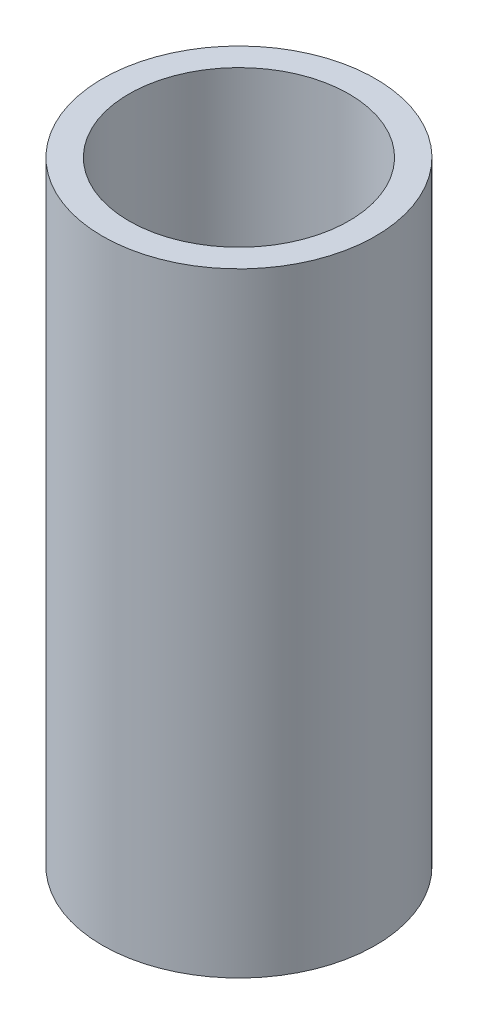
ISO-10303-21;
HEADER;
FILE_DESCRIPTION(('STEP AP214'),'2;1');
FILE_NAME('part.step','',(''),(''),'','','');
FILE_SCHEMA(('AUTOMOTIVE_DESIGN { 1 0 10303 214 1 1 1 1 }'));
ENDSEC;
DATA;
#1=APPLICATION_CONTEXT('core data for automotive mechanical design processes');
#2=APPLICATION_PROTOCOL_DEFINITION('international standard','automotive_design',2000,#1);
#3=PRODUCT_CONTEXT('',#1,'mechanical');
#4=PRODUCT('Part','Part','',(#3));
#5=PRODUCT_RELATED_PRODUCT_CATEGORY('part','',(#4));
#6=PRODUCT_DEFINITION_FORMATION('','',#4);
#7=PRODUCT_DEFINITION_CONTEXT('part definition',#1,'design');
#8=PRODUCT_DEFINITION('design','',#6,#7);
#9=PRODUCT_DEFINITION_SHAPE('','',#8);
#10=(LENGTH_UNIT() NAMED_UNIT(*) SI_UNIT(.MILLI.,.METRE.));
#11=(NAMED_UNIT(*) PLANE_ANGLE_UNIT() SI_UNIT($,.RADIAN.));
#12=(NAMED_UNIT(*) SI_UNIT($,.STERADIAN.) SOLID_ANGLE_UNIT());
#13=UNCERTAINTY_MEASURE_WITH_UNIT(LENGTH_MEASURE(1.E-05),#10,'distance_accuracy_value','');
#14=(GEOMETRIC_REPRESENTATION_CONTEXT(3) GLOBAL_UNCERTAINTY_ASSIGNED_CONTEXT((#13)) GLOBAL_UNIT_ASSIGNED_CONTEXT((#10,
#11,#12)) REPRESENTATION_CONTEXT('',''));
#15=CARTESIAN_POINT('',(0.,0.,0.));
#16=DIRECTION('',(0.,0.,1.));
#17=DIRECTION('',(1.,0.,0.));
#18=AXIS2_PLACEMENT_3D('',#15,#16,#17);
#19=CARTESIAN_POINT('',(0.,36.,0.));
#20=DIRECTION('',(0.,1.,0.));
#21=DIRECTION('',(0.,0.,1.));
#22=AXIS2_PLACEMENT_3D('',#19,#20,#21);
#23=PLANE('',#22);
#24=CARTESIAN_POINT('',(0.,36.,0.));
#25=DIRECTION('',(0.,1.,0.));
#26=DIRECTION('',(0.,0.,1.));
#27=AXIS2_PLACEMENT_3D('',#24,#25,#26);
#28=CIRCLE('',#27,8.);
#29=CARTESIAN_POINT('',(0.,36.,8.));
#30=VERTEX_POINT('',#29);
#31=EDGE_CURVE('E10',#30,#30,#28,.T.);
#32=ORIENTED_EDGE('',*,*,#31,.T.);
#33=EDGE_LOOP('',(#32));
#34=FACE_BOUND('',#33,.T.);
#35=CARTESIAN_POINT('',(0.,36.,0.));
#36=DIRECTION('',(0.,1.,0.));
#37=DIRECTION('',(0.,0.,1.));
#38=AXIS2_PLACEMENT_3D('',#35,#36,#37);
#39=CIRCLE('',#38,6.45);
#40=CARTESIAN_POINT('',(0.,36.,6.45));
#41=VERTEX_POINT('',#40);
#42=EDGE_CURVE('E54',#41,#41,#39,.T.);
#43=ORIENTED_EDGE('',*,*,#42,.F.);
#44=EDGE_LOOP('',(#43));
#45=FACE_BOUND('',#44,.T.);
#46=ADVANCED_FACE('F41',(#34,#45),#23,.T.);
#47=CARTESIAN_POINT('',(0.,0.,0.));
#48=DIRECTION('',(0.,1.,0.));
#49=DIRECTION('',(0.,0.,1.));
#50=AXIS2_PLACEMENT_3D('',#47,#48,#49);
#51=PLANE('',#50);
#52=CARTESIAN_POINT('',(0.,0.,0.));
#53=DIRECTION('',(0.,1.,0.));
#54=DIRECTION('',(0.,0.,1.));
#55=AXIS2_PLACEMENT_3D('',#52,#53,#54);
#56=CIRCLE('',#55,8.);
#57=CARTESIAN_POINT('',(0.,0.,8.));
#58=VERTEX_POINT('',#57);
#59=EDGE_CURVE('E45',#58,#58,#56,.T.);
#60=ORIENTED_EDGE('',*,*,#59,.F.);
#61=EDGE_LOOP('',(#60));
#62=FACE_BOUND('',#61,.T.);
#63=CARTESIAN_POINT('',(0.,0.,0.));
#64=DIRECTION('',(0.,1.,0.));
#65=DIRECTION('',(0.,0.,1.));
#66=AXIS2_PLACEMENT_3D('',#63,#64,#65);
#67=CIRCLE('',#66,6.45);
#68=CARTESIAN_POINT('',(0.,0.,6.45));
#69=VERTEX_POINT('',#68);
#70=EDGE_CURVE('E56',#69,#69,#67,.T.);
#71=ORIENTED_EDGE('',*,*,#70,.T.);
#72=EDGE_LOOP('',(#71));
#73=FACE_BOUND('',#72,.T.);
#74=ADVANCED_FACE('F68',(#62,#73),#51,.F.);
#75=CARTESIAN_POINT('',(0.,36.,0.));
#76=DIRECTION('',(0.,-1.,0.));
#77=DIRECTION('',(0.,0.,-1.));
#78=AXIS2_PLACEMENT_3D('',#75,#76,#77);
#79=CYLINDRICAL_SURFACE('',#78,8.);
#80=ORIENTED_EDGE('',*,*,#31,.F.);
#81=EDGE_LOOP('',(#80));
#82=FACE_BOUND('',#81,.T.);
#83=ORIENTED_EDGE('',*,*,#59,.T.);
#84=EDGE_LOOP('',(#83));
#85=FACE_BOUND('',#84,.T.);
#86=ADVANCED_FACE('F43',(#82,#85),#79,.T.);
#87=CARTESIAN_POINT('',(0.,36.,0.));
#88=DIRECTION('',(0.,-1.,0.));
#89=DIRECTION('',(0.,0.,-1.));
#90=AXIS2_PLACEMENT_3D('',#87,#88,#89);
#91=CYLINDRICAL_SURFACE('',#90,6.45);
#92=ORIENTED_EDGE('',*,*,#42,.T.);
#93=EDGE_LOOP('',(#92));
#94=FACE_BOUND('',#93,.T.);
#95=ORIENTED_EDGE('',*,*,#70,.F.);
#96=EDGE_LOOP('',(#95));
#97=FACE_BOUND('',#96,.T.);
#98=ADVANCED_FACE('F64',(#94,#97),#91,.F.);
#99=CLOSED_SHELL('',(#46,#74,#86,#98));
#100=MANIFOLD_SOLID_BREP('B2',#99);
#101=ADVANCED_BREP_SHAPE_REPRESENTATION('',(#18,#100),#14);
#102=SHAPE_DEFINITION_REPRESENTATION(#9,#101);
ENDSEC;
END-ISO-10303-21;
